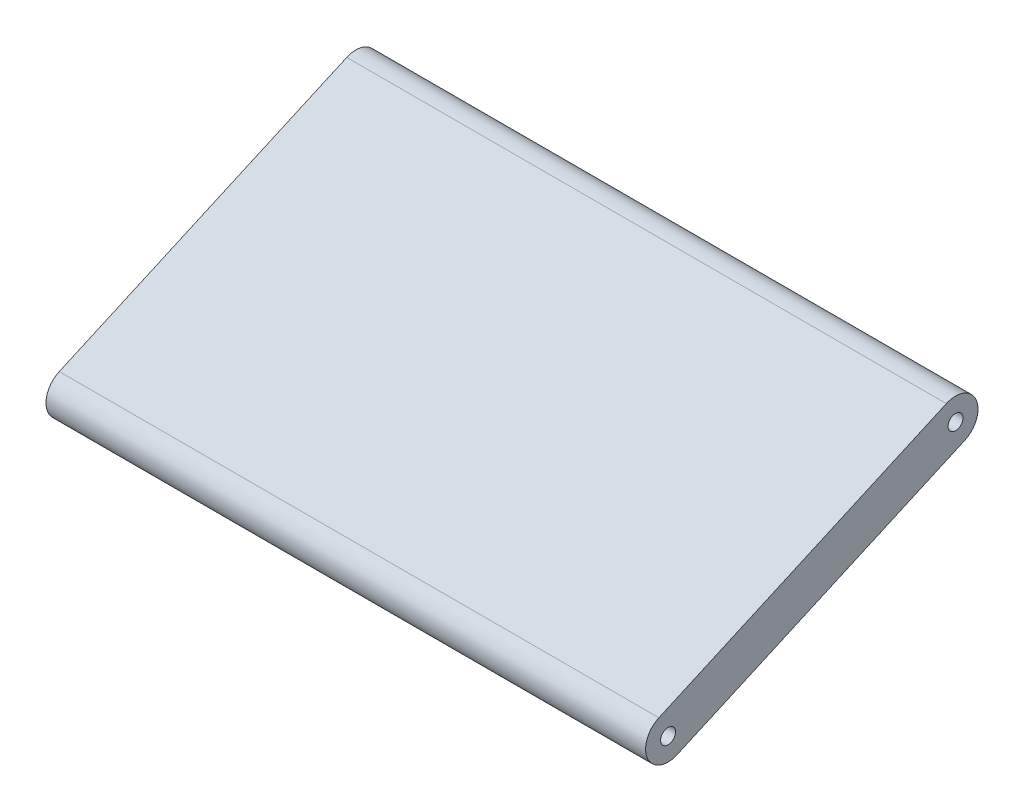
ISO-10303-21;
HEADER;
FILE_DESCRIPTION(('STEP AP214'),'2;1');
FILE_NAME('part.step','',(''),(''),'','','');
FILE_SCHEMA(('AUTOMOTIVE_DESIGN { 1 0 10303 214 1 1 1 1 }'));
ENDSEC;
DATA;
#1=APPLICATION_CONTEXT('core data for automotive mechanical design processes');
#2=APPLICATION_PROTOCOL_DEFINITION('international standard','automotive_design',2000,#1);
#3=PRODUCT_CONTEXT('',#1,'mechanical');
#4=PRODUCT('Part','Part','',(#3));
#5=PRODUCT_RELATED_PRODUCT_CATEGORY('part','',(#4));
#6=PRODUCT_DEFINITION_FORMATION('','',#4);
#7=PRODUCT_DEFINITION_CONTEXT('part definition',#1,'design');
#8=PRODUCT_DEFINITION('design','',#6,#7);
#9=PRODUCT_DEFINITION_SHAPE('','',#8);
#10=(LENGTH_UNIT() NAMED_UNIT(*) SI_UNIT(.MILLI.,.METRE.));
#11=(NAMED_UNIT(*) PLANE_ANGLE_UNIT() SI_UNIT($,.RADIAN.));
#12=(NAMED_UNIT(*) SI_UNIT($,.STERADIAN.) SOLID_ANGLE_UNIT());
#13=UNCERTAINTY_MEASURE_WITH_UNIT(LENGTH_MEASURE(1.E-05),#10,'distance_accuracy_value','');
#14=(GEOMETRIC_REPRESENTATION_CONTEXT(3) GLOBAL_UNCERTAINTY_ASSIGNED_CONTEXT((#13)) GLOBAL_UNIT_ASSIGNED_CONTEXT((#10,
#11,#12)) REPRESENTATION_CONTEXT('',''));
#15=CARTESIAN_POINT('',(0.,0.,0.));
#16=DIRECTION('',(0.,0.,1.));
#17=DIRECTION('',(1.,0.,0.));
#18=AXIS2_PLACEMENT_3D('',#15,#16,#17);
#19=CARTESIAN_POINT('',(10.,-7.60665214720199,7.19331903773411));
#20=DIRECTION('',(1.,0.,0.));
#21=DIRECTION('',(0.,0.,-1.));
#22=AXIS2_PLACEMENT_3D('',#19,#20,#21);
#23=PLANE('',#22);
#24=CARTESIAN_POINT('',(10.,-5.4669065046789,2.39915711042049));
#25=DIRECTION('',(1.,0.,0.));
#26=DIRECTION('',(0.,0.,-1.));
#27=AXIS2_PLACEMENT_3D('',#24,#25,#26);
#28=CIRCLE('',#27,0.125);
#29=CARTESIAN_POINT('',(10.,-5.4669065046789,2.27415711042049));
#30=VERTEX_POINT('',#29);
#31=EDGE_CURVE('E100',#30,#30,#28,.T.);
#32=ORIENTED_EDGE('',*,*,#31,.F.);
#33=EDGE_LOOP('',(#32));
#34=FACE_BOUND('',#33,.T.);
#35=CARTESIAN_POINT('',(10.,-7.60665214720199,7.19331903773411));
#36=DIRECTION('',(1.,0.,0.));
#37=DIRECTION('',(0.,0.,-1.));
#38=AXIS2_PLACEMENT_3D('',#35,#36,#37);
#39=CIRCLE('',#38,0.375000000000001);
#40=CARTESIAN_POINT('',(10.,-7.26421200953673,7.34615801220004));
#41=VERTEX_POINT('',#40);
#42=CARTESIAN_POINT('',(10.,-7.94909228486725,7.04048006326817));
#43=VERTEX_POINT('',#42);
#44=EDGE_CURVE('E85',#41,#43,#39,.T.);
#45=ORIENTED_EDGE('',*,*,#44,.T.);
#46=DIRECTION('',(0.,0.407570598575828,-0.913173700440689));
#47=VECTOR('',#46,1.);
#48=CARTESIAN_POINT('',(10.,-7.94909228486725,7.04048006326817));
#49=LINE('',#48,#47);
#50=CARTESIAN_POINT('',(10.,-5.80934664234415,2.24631813595455));
#51=VERTEX_POINT('',#50);
#52=EDGE_CURVE('E80',#43,#51,#49,.T.);
#53=ORIENTED_EDGE('',*,*,#52,.T.);
#54=CARTESIAN_POINT('',(10.,-5.4669065046789,2.39915711042049));
#55=DIRECTION('',(1.,0.,0.));
#56=DIRECTION('',(0.,0.,-1.));
#57=AXIS2_PLACEMENT_3D('',#54,#55,#56);
#58=CIRCLE('',#57,0.375000000000001);
#59=CARTESIAN_POINT('',(10.,-5.12446636701364,2.55199608488642));
#60=VERTEX_POINT('',#59);
#61=EDGE_CURVE('E83',#51,#60,#58,.T.);
#62=ORIENTED_EDGE('',*,*,#61,.T.);
#63=DIRECTION('',(0.,-0.407570598575827,0.913173700440689));
#64=VECTOR('',#63,1.);
#65=CARTESIAN_POINT('',(10.,-7.26421200953673,7.34615801220004));
#66=LINE('',#65,#64);
#67=EDGE_CURVE('E50',#60,#41,#66,.T.);
#68=ORIENTED_EDGE('',*,*,#67,.T.);
#69=EDGE_LOOP('',(#45,#53,#62,#68));
#70=FACE_BOUND('',#69,.T.);
#71=CARTESIAN_POINT('',(10.,-7.60665214720199,7.19331903773411));
#72=DIRECTION('',(1.,0.,0.));
#73=DIRECTION('',(0.,0.,-1.));
#74=AXIS2_PLACEMENT_3D('',#71,#72,#73);
#75=CIRCLE('',#74,0.125);
#76=CARTESIAN_POINT('',(10.,-7.60665214720199,7.06831903773411));
#77=VERTEX_POINT('',#76);
#78=EDGE_CURVE('E115',#77,#77,#75,.T.);
#79=ORIENTED_EDGE('',*,*,#78,.F.);
#80=EDGE_LOOP('',(#79));
#81=FACE_BOUND('',#80,.T.);
#82=ADVANCED_FACE('F33',(#34,#70,#81),#23,.T.);
#83=CARTESIAN_POINT('',(0.,-7.60665214720199,7.19331903773411));
#84=DIRECTION('',(1.,0.,0.));
#85=DIRECTION('',(0.,0.,-1.));
#86=AXIS2_PLACEMENT_3D('',#83,#84,#85);
#87=PLANE('',#86);
#88=CARTESIAN_POINT('',(0.,-7.60665214720199,7.19331903773411));
#89=DIRECTION('',(1.,0.,0.));
#90=DIRECTION('',(0.,0.,-1.));
#91=AXIS2_PLACEMENT_3D('',#88,#89,#90);
#92=CIRCLE('',#91,0.375000000000001);
#93=CARTESIAN_POINT('',(0.,-7.26421200953673,7.34615801220004));
#94=VERTEX_POINT('',#93);
#95=CARTESIAN_POINT('',(0.,-7.94909228486725,7.04048006326817));
#96=VERTEX_POINT('',#95);
#97=EDGE_CURVE('E97',#94,#96,#92,.T.);
#98=ORIENTED_EDGE('',*,*,#97,.F.);
#99=DIRECTION('',(0.,-0.407570598575827,0.913173700440689));
#100=VECTOR('',#99,1.);
#101=CARTESIAN_POINT('',(0.,-7.26421200953673,7.34615801220004));
#102=LINE('',#101,#100);
#103=CARTESIAN_POINT('',(0.,-5.12446636701364,2.55199608488642));
#104=VERTEX_POINT('',#103);
#105=EDGE_CURVE('E73',#104,#94,#102,.T.);
#106=ORIENTED_EDGE('',*,*,#105,.F.);
#107=CARTESIAN_POINT('',(0.,-5.4669065046789,2.39915711042049));
#108=DIRECTION('',(1.,0.,0.));
#109=DIRECTION('',(0.,0.,-1.));
#110=AXIS2_PLACEMENT_3D('',#107,#108,#109);
#111=CIRCLE('',#110,0.375000000000001);
#112=CARTESIAN_POINT('',(0.,-5.80934664234415,2.24631813595455));
#113=VERTEX_POINT('',#112);
#114=EDGE_CURVE('E67',#113,#104,#111,.T.);
#115=ORIENTED_EDGE('',*,*,#114,.F.);
#116=DIRECTION('',(0.,0.407570598575828,-0.913173700440689));
#117=VECTOR('',#116,1.);
#118=CARTESIAN_POINT('',(0.,-7.94909228486725,7.04048006326817));
#119=LINE('',#118,#117);
#120=EDGE_CURVE('E89',#96,#113,#119,.T.);
#121=ORIENTED_EDGE('',*,*,#120,.F.);
#122=EDGE_LOOP('',(#98,#106,#115,#121));
#123=FACE_BOUND('',#122,.T.);
#124=CARTESIAN_POINT('',(0.,-5.4669065046789,2.39915711042049));
#125=DIRECTION('',(1.,0.,0.));
#126=DIRECTION('',(0.,0.,-1.));
#127=AXIS2_PLACEMENT_3D('',#124,#125,#126);
#128=CIRCLE('',#127,0.125);
#129=CARTESIAN_POINT('',(0.,-5.4669065046789,2.27415711042049));
#130=VERTEX_POINT('',#129);
#131=EDGE_CURVE('E112',#130,#130,#128,.T.);
#132=ORIENTED_EDGE('',*,*,#131,.T.);
#133=EDGE_LOOP('',(#132));
#134=FACE_BOUND('',#133,.T.);
#135=CARTESIAN_POINT('',(0.,-7.60665214720199,7.19331903773411));
#136=DIRECTION('',(1.,0.,0.));
#137=DIRECTION('',(0.,0.,-1.));
#138=AXIS2_PLACEMENT_3D('',#135,#136,#137);
#139=CIRCLE('',#138,0.125);
#140=CARTESIAN_POINT('',(0.,-7.60665214720199,7.06831903773411));
#141=VERTEX_POINT('',#140);
#142=EDGE_CURVE('E118',#141,#141,#139,.T.);
#143=ORIENTED_EDGE('',*,*,#142,.T.);
#144=EDGE_LOOP('',(#143));
#145=FACE_BOUND('',#144,.T.);
#146=ADVANCED_FACE('F108',(#123,#134,#145),#87,.F.);
#147=CARTESIAN_POINT('',(10.,-7.60665214720199,7.19331903773411));
#148=DIRECTION('',(-1.,0.,0.));
#149=DIRECTION('',(0.,0.,1.));
#150=AXIS2_PLACEMENT_3D('',#147,#148,#149);
#151=CYLINDRICAL_SURFACE('',#150,0.375000000000001);
#152=ORIENTED_EDGE('',*,*,#97,.T.);
#153=DIRECTION('',(-1.,0.,0.));
#154=VECTOR('',#153,1.);
#155=CARTESIAN_POINT('',(10.,-7.94909228486725,7.04048006326817));
#156=LINE('',#155,#154);
#157=EDGE_CURVE('E11',#43,#96,#156,.T.);
#158=ORIENTED_EDGE('',*,*,#157,.F.);
#159=ORIENTED_EDGE('',*,*,#44,.F.);
#160=DIRECTION('',(-1.,0.,0.));
#161=VECTOR('',#160,1.);
#162=CARTESIAN_POINT('',(10.,-7.26421200953673,7.34615801220004));
#163=LINE('',#162,#161);
#164=EDGE_CURVE('E93',#41,#94,#163,.T.);
#165=ORIENTED_EDGE('',*,*,#164,.T.);
#166=EDGE_LOOP('',(#152,#158,#159,#165));
#167=FACE_BOUND('',#166,.T.);
#168=ADVANCED_FACE('F35',(#167),#151,.T.);
#169=CARTESIAN_POINT('',(10.,-7.94909228486725,7.04048006326817));
#170=DIRECTION('',(0.,0.913173700440689,0.407570598575828));
#171=DIRECTION('',(0.,-0.407570598575827,0.913173700440689));
#172=AXIS2_PLACEMENT_3D('',#169,#170,#171);
#173=PLANE('',#172);
#174=ORIENTED_EDGE('',*,*,#120,.T.);
#175=DIRECTION('',(-1.,0.,0.));
#176=VECTOR('',#175,1.);
#177=CARTESIAN_POINT('',(10.,-5.80934664234415,2.24631813595455));
#178=LINE('',#177,#176);
#179=EDGE_CURVE('E42',#51,#113,#178,.T.);
#180=ORIENTED_EDGE('',*,*,#179,.F.);
#181=ORIENTED_EDGE('',*,*,#52,.F.);
#182=ORIENTED_EDGE('',*,*,#157,.T.);
#183=EDGE_LOOP('',(#174,#180,#181,#182));
#184=FACE_BOUND('',#183,.T.);
#185=ADVANCED_FACE('F88',(#184),#173,.F.);
#186=CARTESIAN_POINT('',(10.,-5.4669065046789,2.39915711042049));
#187=DIRECTION('',(-1.,0.,0.));
#188=DIRECTION('',(0.,0.,1.));
#189=AXIS2_PLACEMENT_3D('',#186,#187,#188);
#190=CYLINDRICAL_SURFACE('',#189,0.375000000000001);
#191=ORIENTED_EDGE('',*,*,#114,.T.);
#192=DIRECTION('',(-1.,0.,0.));
#193=VECTOR('',#192,1.);
#194=CARTESIAN_POINT('',(10.,-5.12446636701364,2.55199608488642));
#195=LINE('',#194,#193);
#196=EDGE_CURVE('E90',#60,#104,#195,.T.);
#197=ORIENTED_EDGE('',*,*,#196,.F.);
#198=ORIENTED_EDGE('',*,*,#61,.F.);
#199=ORIENTED_EDGE('',*,*,#179,.T.);
#200=EDGE_LOOP('',(#191,#197,#198,#199));
#201=FACE_BOUND('',#200,.T.);
#202=ADVANCED_FACE('F91',(#201),#190,.T.);
#203=CARTESIAN_POINT('',(10.,-7.26421200953673,7.34615801220004));
#204=DIRECTION('',(0.,-0.913173700440689,-0.407570598575827));
#205=DIRECTION('',(0.,0.407570598575827,-0.913173700440689));
#206=AXIS2_PLACEMENT_3D('',#203,#204,#205);
#207=PLANE('',#206);
#208=ORIENTED_EDGE('',*,*,#105,.T.);
#209=ORIENTED_EDGE('',*,*,#164,.F.);
#210=ORIENTED_EDGE('',*,*,#67,.F.);
#211=ORIENTED_EDGE('',*,*,#196,.T.);
#212=EDGE_LOOP('',(#208,#209,#210,#211));
#213=FACE_BOUND('',#212,.T.);
#214=ADVANCED_FACE('F105',(#213),#207,.F.);
#215=CARTESIAN_POINT('',(10.,-5.4669065046789,2.39915711042049));
#216=DIRECTION('',(-1.,0.,0.));
#217=DIRECTION('',(0.,0.,1.));
#218=AXIS2_PLACEMENT_3D('',#215,#216,#217);
#219=CYLINDRICAL_SURFACE('',#218,0.125);
#220=ORIENTED_EDGE('',*,*,#31,.T.);
#221=EDGE_LOOP('',(#220));
#222=FACE_BOUND('',#221,.T.);
#223=ORIENTED_EDGE('',*,*,#131,.F.);
#224=EDGE_LOOP('',(#223));
#225=FACE_BOUND('',#224,.T.);
#226=ADVANCED_FACE('F135',(#222,#225),#219,.F.);
#227=CARTESIAN_POINT('',(10.,-7.60665214720199,7.19331903773411));
#228=DIRECTION('',(-1.,0.,0.));
#229=DIRECTION('',(0.,0.,1.));
#230=AXIS2_PLACEMENT_3D('',#227,#228,#229);
#231=CYLINDRICAL_SURFACE('',#230,0.125);
#232=ORIENTED_EDGE('',*,*,#78,.T.);
#233=EDGE_LOOP('',(#232));
#234=FACE_BOUND('',#233,.T.);
#235=ORIENTED_EDGE('',*,*,#142,.F.);
#236=EDGE_LOOP('',(#235));
#237=FACE_BOUND('',#236,.T.);
#238=ADVANCED_FACE('F124',(#234,#237),#231,.F.);
#239=CLOSED_SHELL('',(#82,#146,#168,#185,#202,#214,#226,#238));
#240=MANIFOLD_SOLID_BREP('B2',#239);
#241=ADVANCED_BREP_SHAPE_REPRESENTATION('',(#18,#240),#14);
#242=SHAPE_DEFINITION_REPRESENTATION(#9,#241);
ENDSEC;
END-ISO-10303-21;
